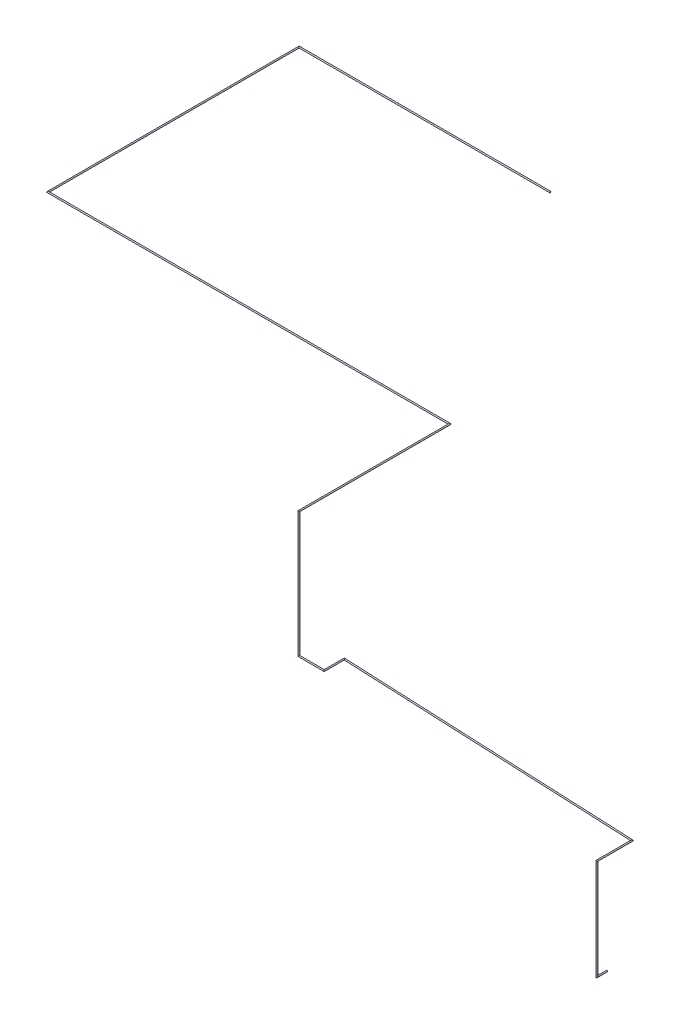
ISO-10303-21;
HEADER;
FILE_DESCRIPTION(('STEP AP214'),'2;1');
FILE_NAME('part.step','',(''),(''),'','','');
FILE_SCHEMA(('AUTOMOTIVE_DESIGN { 1 0 10303 214 1 1 1 1 }'));
ENDSEC;
DATA;
#1=APPLICATION_CONTEXT('core data for automotive mechanical design processes');
#2=APPLICATION_PROTOCOL_DEFINITION('international standard','automotive_design',2000,#1);
#3=PRODUCT_CONTEXT('',#1,'mechanical');
#4=PRODUCT('Part','Part','',(#3));
#5=PRODUCT_RELATED_PRODUCT_CATEGORY('part','',(#4));
#6=PRODUCT_DEFINITION_FORMATION('','',#4);
#7=PRODUCT_DEFINITION_CONTEXT('part definition',#1,'design');
#8=PRODUCT_DEFINITION('design','',#6,#7);
#9=PRODUCT_DEFINITION_SHAPE('','',#8);
#10=(LENGTH_UNIT() NAMED_UNIT(*) SI_UNIT(.MILLI.,.METRE.));
#11=(NAMED_UNIT(*) PLANE_ANGLE_UNIT() SI_UNIT($,.RADIAN.));
#12=(NAMED_UNIT(*) SI_UNIT($,.STERADIAN.) SOLID_ANGLE_UNIT());
#13=UNCERTAINTY_MEASURE_WITH_UNIT(LENGTH_MEASURE(1.E-05),#10,'distance_accuracy_value','');
#14=(GEOMETRIC_REPRESENTATION_CONTEXT(3) GLOBAL_UNCERTAINTY_ASSIGNED_CONTEXT((#13)) GLOBAL_UNIT_ASSIGNED_CONTEXT((#10,
#11,#12)) REPRESENTATION_CONTEXT('',''));
#15=CARTESIAN_POINT('',(0.,0.,0.));
#16=DIRECTION('',(0.,0.,1.));
#17=DIRECTION('',(1.,0.,0.));
#18=AXIS2_PLACEMENT_3D('',#15,#16,#17);
#19=CARTESIAN_POINT('',(0.,0.,100.));
#20=DIRECTION('',(0.,0.,-1.));
#21=DIRECTION('',(-1.,0.,0.));
#22=AXIS2_PLACEMENT_3D('',#19,#20,#21);
#23=CYLINDRICAL_SURFACE('',#22,12.7);
#24=CARTESIAN_POINT('',(0.,0.,0.));
#25=DIRECTION('',(0.,0.,1.));
#26=DIRECTION('',(1.,0.,0.));
#27=AXIS2_PLACEMENT_3D('',#24,#25,#26);
#28=CIRCLE('',#27,12.7);
#29=CARTESIAN_POINT('',(12.7,0.,0.));
#30=VERTEX_POINT('',#29);
#31=EDGE_CURVE('E11',#30,#30,#28,.T.);
#32=ORIENTED_EDGE('',*,*,#31,.T.);
#33=EDGE_LOOP('',(#32));
#34=FACE_BOUND('',#33,.T.);
#35=CARTESIAN_POINT('',(0.,0.,200.));
#36=DIRECTION('',(0.,0.707106781186548,0.707106781186548));
#37=DIRECTION('',(0.,-0.707106781186548,0.707106781186548));
#38=AXIS2_PLACEMENT_3D('',#35,#36,#37);
#39=ELLIPSE('',#38,17.9605122421383,12.7);
#40=CARTESIAN_POINT('',(0.,-12.7,212.7));
#41=VERTEX_POINT('',#40);
#42=EDGE_CURVE('E40',#41,#41,#39,.F.);
#43=ORIENTED_EDGE('',*,*,#42,.T.);
#44=EDGE_LOOP('',(#43));
#45=FACE_BOUND('',#44,.T.);
#46=ADVANCED_FACE('F33',(#34,#45),#23,.T.);
#47=CARTESIAN_POINT('',(0.,0.,0.));
#48=DIRECTION('',(0.,0.,1.));
#49=DIRECTION('',(1.,0.,0.));
#50=AXIS2_PLACEMENT_3D('',#47,#48,#49);
#51=PLANE('',#50);
#52=ORIENTED_EDGE('',*,*,#31,.F.);
#53=EDGE_LOOP('',(#52));
#54=FACE_BOUND('',#53,.T.);
#55=ADVANCED_FACE('F125',(#54),#51,.F.);
#56=CARTESIAN_POINT('',(-9494.14406998089,4500.,-8365.02239209735));
#57=DIRECTION('',(1.,0.,0.));
#58=DIRECTION('',(0.,-1.,0.));
#59=AXIS2_PLACEMENT_3D('',#56,#57,#58);
#60=PLANE('',#59);
#61=CARTESIAN_POINT('',(-9494.14406998089,4500.,-8365.02239209735));
#62=DIRECTION('',(1.,0.,0.));
#63=DIRECTION('',(0.,-1.,0.));
#64=AXIS2_PLACEMENT_3D('',#61,#62,#63);
#65=CIRCLE('',#64,12.7);
#66=CARTESIAN_POINT('',(-9494.14406998089,4487.3,-8365.02239209735));
#67=VERTEX_POINT('',#66);
#68=EDGE_CURVE('E45',#67,#67,#65,.T.);
#69=ORIENTED_EDGE('',*,*,#68,.T.);
#70=EDGE_LOOP('',(#69));
#71=FACE_BOUND('',#70,.T.);
#72=ADVANCED_FACE('F122',(#71),#60,.T.);
#73=CARTESIAN_POINT('',(-14522.1840699809,4500.,-8365.02239209735));
#74=DIRECTION('',(1.,0.,0.));
#75=DIRECTION('',(0.,0.,-1.));
#76=AXIS2_PLACEMENT_3D('',#73,#74,#75);
#77=CYLINDRICAL_SURFACE('',#76,12.7);
#78=CARTESIAN_POINT('',(-14494.1440699809,4500.,-8365.02239209735));
#79=DIRECTION('',(0.707106781186548,0.,-0.707106781186548));
#80=DIRECTION('',(-0.707106781186548,0.,-0.707106781186548));
#81=AXIS2_PLACEMENT_3D('',#78,#79,#80);
#82=ELLIPSE('',#81,17.9605122421383,12.7);
#83=CARTESIAN_POINT('',(-14506.8440699809,4500.,-8377.72239209735));
#84=VERTEX_POINT('',#83);
#85=EDGE_CURVE('E50',#84,#84,#82,.F.);
#86=ORIENTED_EDGE('',*,*,#85,.F.);
#87=EDGE_LOOP('',(#86));
#88=FACE_BOUND('',#87,.T.);
#89=ORIENTED_EDGE('',*,*,#68,.F.);
#90=EDGE_LOOP('',(#89));
#91=FACE_BOUND('',#90,.T.);
#92=ADVANCED_FACE('F112',(#88,#91),#77,.T.);
#93=CARTESIAN_POINT('',(-14494.1440699809,4500.,-3336.98239209735));
#94=DIRECTION('',(0.,0.,-1.));
#95=DIRECTION('',(-1.,0.,0.));
#96=AXIS2_PLACEMENT_3D('',#93,#94,#95);
#97=CYLINDRICAL_SURFACE('',#96,12.7);
#98=CARTESIAN_POINT('',(-14494.1440699809,4500.,-3365.02239209735));
#99=DIRECTION('',(-0.707106781186547,0.,-0.707106781186547));
#100=DIRECTION('',(-0.707106781186548,0.,0.707106781186548));
#101=AXIS2_PLACEMENT_3D('',#98,#99,#100);
#102=ELLIPSE('',#101,17.9605122421383,12.7);
#103=CARTESIAN_POINT('',(-14506.8440699809,4500.,-3352.32239209735));
#104=VERTEX_POINT('',#103);
#105=EDGE_CURVE('E105',#104,#104,#102,.F.);
#106=ORIENTED_EDGE('',*,*,#105,.F.);
#107=EDGE_LOOP('',(#106));
#108=FACE_BOUND('',#107,.T.);
#109=ORIENTED_EDGE('',*,*,#85,.T.);
#110=EDGE_LOOP('',(#109));
#111=FACE_BOUND('',#110,.T.);
#112=ADVANCED_FACE('F109',(#108,#111),#97,.T.);
#113=CARTESIAN_POINT('',(-6466.10406998089,4500.,-3365.02239209735));
#114=DIRECTION('',(-1.,0.,0.));
#115=DIRECTION('',(0.,0.,1.));
#116=AXIS2_PLACEMENT_3D('',#113,#114,#115);
#117=CYLINDRICAL_SURFACE('',#116,12.7);
#118=CARTESIAN_POINT('',(-6494.14406998088,4500.,-3365.02239209735));
#119=DIRECTION('',(-0.707106781186548,0.,-0.707106781186548));
#120=DIRECTION('',(0.707106781186548,0.,-0.707106781186548));
#121=AXIS2_PLACEMENT_3D('',#118,#119,#120);
#122=ELLIPSE('',#121,17.9605122421383,12.7);
#123=CARTESIAN_POINT('',(-6481.44406998088,4500.,-3377.72239209735));
#124=VERTEX_POINT('',#123);
#125=EDGE_CURVE('E102',#124,#124,#122,.F.);
#126=ORIENTED_EDGE('',*,*,#125,.F.);
#127=EDGE_LOOP('',(#126));
#128=FACE_BOUND('',#127,.T.);
#129=ORIENTED_EDGE('',*,*,#105,.T.);
#130=EDGE_LOOP('',(#129));
#131=FACE_BOUND('',#130,.T.);
#132=ADVANCED_FACE('F111',(#128,#131),#117,.T.);
#133=CARTESIAN_POINT('',(-6494.14406998088,4500.,-350.952392097353));
#134=DIRECTION('',(0.,0.,-1.));
#135=DIRECTION('',(-1.,0.,0.));
#136=AXIS2_PLACEMENT_3D('',#133,#134,#135);
#137=CYLINDRICAL_SURFACE('',#136,12.7);
#138=CARTESIAN_POINT('',(-6494.14406998088,4500.,-365.022392097351));
#139=DIRECTION('',(0.,0.707106781186548,-0.707106781186548));
#140=DIRECTION('',(0.,0.707106781186548,0.707106781186548));
#141=AXIS2_PLACEMENT_3D('',#138,#139,#140);
#142=ELLIPSE('',#141,17.9605122421383,12.7);
#143=CARTESIAN_POINT('',(-6494.14406998088,4512.7,-352.322392097351));
#144=VERTEX_POINT('',#143);
#145=EDGE_CURVE('E99',#144,#144,#142,.F.);
#146=ORIENTED_EDGE('',*,*,#145,.F.);
#147=EDGE_LOOP('',(#146));
#148=FACE_BOUND('',#147,.T.);
#149=ORIENTED_EDGE('',*,*,#125,.T.);
#150=EDGE_LOOP('',(#149));
#151=FACE_BOUND('',#150,.T.);
#152=ADVANCED_FACE('F119',(#148,#151),#137,.T.);
#153=CARTESIAN_POINT('',(-6494.14406998088,1971.96,-365.022392097351));
#154=DIRECTION('',(0.,1.,0.));
#155=DIRECTION('',(0.,0.,1.));
#156=AXIS2_PLACEMENT_3D('',#153,#154,#155);
#157=CYLINDRICAL_SURFACE('',#156,12.7);
#158=CARTESIAN_POINT('',(-6494.14406998088,2000.,-365.022392097351));
#159=DIRECTION('',(-0.707106781186547,0.707106781186547,0.));
#160=DIRECTION('',(-0.707106781186548,-0.707106781186548,0.));
#161=AXIS2_PLACEMENT_3D('',#158,#159,#160);
#162=ELLIPSE('',#161,17.9605122421383,12.7);
#163=CARTESIAN_POINT('',(-6506.84406998088,1987.3,-365.022392097351));
#164=VERTEX_POINT('',#163);
#165=EDGE_CURVE('E96',#164,#164,#162,.F.);
#166=ORIENTED_EDGE('',*,*,#165,.F.);
#167=EDGE_LOOP('',(#166));
#168=FACE_BOUND('',#167,.T.);
#169=ORIENTED_EDGE('',*,*,#145,.T.);
#170=EDGE_LOOP('',(#169));
#171=FACE_BOUND('',#170,.T.);
#172=ADVANCED_FACE('F156',(#168,#171),#157,.T.);
#173=CARTESIAN_POINT('',(-5980.07406998088,2000.,-365.022392097351));
#174=DIRECTION('',(-1.,0.,0.));
#175=DIRECTION('',(0.,0.,1.));
#176=AXIS2_PLACEMENT_3D('',#173,#174,#175);
#177=CYLINDRICAL_SURFACE('',#176,12.7);
#178=CARTESIAN_POINT('',(-5994.14406998088,2000.,-365.022392097351));
#179=DIRECTION('',(-0.707106781186548,0.,0.707106781186548));
#180=DIRECTION('',(0.707106781186548,0.,0.707106781186548));
#181=AXIS2_PLACEMENT_3D('',#178,#179,#180);
#182=ELLIPSE('',#181,17.9605122421383,12.7);
#183=CARTESIAN_POINT('',(-5981.44406998088,2000.,-352.322392097351));
#184=VERTEX_POINT('',#183);
#185=EDGE_CURVE('E93',#184,#184,#182,.F.);
#186=ORIENTED_EDGE('',*,*,#185,.F.);
#187=EDGE_LOOP('',(#186));
#188=FACE_BOUND('',#187,.T.);
#189=ORIENTED_EDGE('',*,*,#165,.T.);
#190=EDGE_LOOP('',(#189));
#191=FACE_BOUND('',#190,.T.);
#192=ADVANCED_FACE('F152',(#188,#191),#177,.T.);
#193=CARTESIAN_POINT('',(-5994.14406998088,2000.,-779.723703276359));
#194=DIRECTION('',(0.,0.,1.));
#195=DIRECTION('',(1.,0.,0.));
#196=AXIS2_PLACEMENT_3D('',#193,#194,#195);
#197=CYLINDRICAL_SURFACE('',#196,12.7);
#198=CARTESIAN_POINT('',(-5994.14406998088,2000.,-765.022392097352));
#199=DIRECTION('',(-0.722554634156785,0.,0.691313822123176));
#200=DIRECTION('',(-0.691313822123176,0.,-0.722554634156785));
#201=AXIS2_PLACEMENT_3D('',#198,#199,#200);
#202=ELLIPSE('',#201,18.3708174111079,12.7);
#203=CARTESIAN_POINT('',(-6006.84406998088,2000.,-778.296311350996));
#204=VERTEX_POINT('',#203);
#205=EDGE_CURVE('E90',#204,#204,#202,.F.);
#206=ORIENTED_EDGE('',*,*,#205,.F.);
#207=EDGE_LOOP('',(#206));
#208=FACE_BOUND('',#207,.T.);
#209=ORIENTED_EDGE('',*,*,#185,.T.);
#210=EDGE_LOOP('',(#209));
#211=FACE_BOUND('',#210,.T.);
#212=ADVANCED_FACE('F148',(#208,#211),#197,.T.);
#213=CARTESIAN_POINT('',(13.4528419315663,2000.,-499.405202092645));
#214=DIRECTION('',(-0.999024011663481,0.,-0.044170398682892));
#215=DIRECTION('',(-0.044170398682892,0.,0.999024011663481));
#216=AXIS2_PLACEMENT_3D('',#213,#214,#215);
#217=CYLINDRICAL_SURFACE('',#216,12.7);
#218=CARTESIAN_POINT('',(0.,2000.,-500.));
#219=DIRECTION('',(-0.691313822123176,0.,-0.722554634156785));
#220=DIRECTION('',(0.722554634156785,0.,-0.691313822123176));
#221=AXIS2_PLACEMENT_3D('',#218,#219,#220);
#222=ELLIPSE('',#221,17.5765255658775,12.7);
#223=CARTESIAN_POINT('',(12.7,2000.,-512.150895068592));
#224=VERTEX_POINT('',#223);
#225=EDGE_CURVE('E85',#224,#224,#222,.F.);
#226=ORIENTED_EDGE('',*,*,#225,.F.);
#227=EDGE_LOOP('',(#226));
#228=FACE_BOUND('',#227,.T.);
#229=ORIENTED_EDGE('',*,*,#205,.T.);
#230=EDGE_LOOP('',(#229));
#231=FACE_BOUND('',#230,.T.);
#232=ADVANCED_FACE('F142',(#228,#231),#217,.T.);
#233=CARTESIAN_POINT('',(0.,2000.,228.04));
#234=DIRECTION('',(0.,0.,-1.));
#235=DIRECTION('',(-1.,0.,0.));
#236=AXIS2_PLACEMENT_3D('',#233,#234,#235);
#237=CYLINDRICAL_SURFACE('',#236,12.7);
#238=CARTESIAN_POINT('',(0.,2000.,200.));
#239=DIRECTION('',(0.,0.707106781186548,-0.707106781186548));
#240=DIRECTION('',(0.,0.707106781186548,0.707106781186548));
#241=AXIS2_PLACEMENT_3D('',#238,#239,#240);
#242=ELLIPSE('',#241,17.9605122421383,12.7);
#243=CARTESIAN_POINT('',(0.,2012.7,212.7));
#244=VERTEX_POINT('',#243);
#245=EDGE_CURVE('E82',#244,#244,#242,.F.);
#246=ORIENTED_EDGE('',*,*,#245,.F.);
#247=EDGE_LOOP('',(#246));
#248=FACE_BOUND('',#247,.T.);
#249=ORIENTED_EDGE('',*,*,#225,.T.);
#250=EDGE_LOOP('',(#249));
#251=FACE_BOUND('',#250,.T.);
#252=ADVANCED_FACE('F137',(#248,#251),#237,.T.);
#253=CARTESIAN_POINT('',(0.,-28.04,200.));
#254=DIRECTION('',(0.,1.,0.));
#255=DIRECTION('',(0.,0.,1.));
#256=AXIS2_PLACEMENT_3D('',#253,#254,#255);
#257=CYLINDRICAL_SURFACE('',#256,12.7);
#258=ORIENTED_EDGE('',*,*,#42,.F.);
#259=EDGE_LOOP('',(#258));
#260=FACE_BOUND('',#259,.T.);
#261=ORIENTED_EDGE('',*,*,#245,.T.);
#262=EDGE_LOOP('',(#261));
#263=FACE_BOUND('',#262,.T.);
#264=ADVANCED_FACE('F79',(#260,#263),#257,.T.);
#265=CLOSED_SHELL('',(#46,#55,#72,#92,#112,#132,#152,#172,#192,#212,#232,#252,#264));
#266=MANIFOLD_SOLID_BREP('B2',#265);
#267=ADVANCED_BREP_SHAPE_REPRESENTATION('',(#18,#266),#14);
#268=SHAPE_DEFINITION_REPRESENTATION(#9,#267);
ENDSEC;
END-ISO-10303-21;
